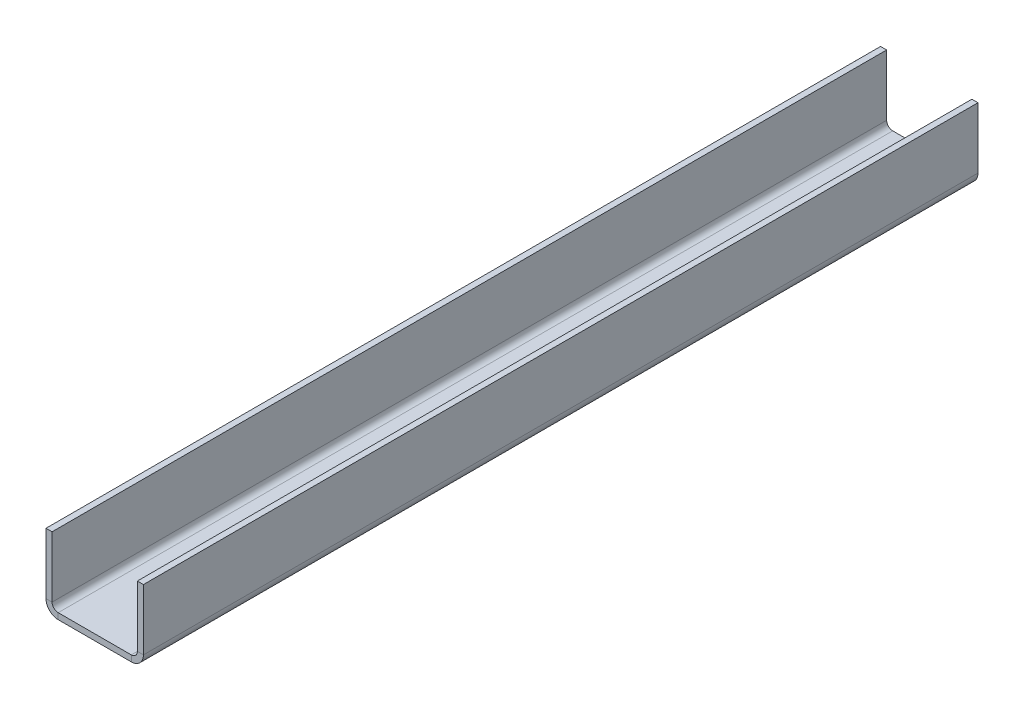
ISO-10303-21;
HEADER;
FILE_DESCRIPTION(('STEP AP214'),'2;1');
FILE_NAME('part.step','',(''),(''),'','','');
FILE_SCHEMA(('AUTOMOTIVE_DESIGN { 1 0 10303 214 1 1 1 1 }'));
ENDSEC;
DATA;
#1=APPLICATION_CONTEXT('core data for automotive mechanical design processes');
#2=APPLICATION_PROTOCOL_DEFINITION('international standard','automotive_design',2000,#1);
#3=PRODUCT_CONTEXT('',#1,'mechanical');
#4=PRODUCT('Part','Part','',(#3));
#5=PRODUCT_RELATED_PRODUCT_CATEGORY('part','',(#4));
#6=PRODUCT_DEFINITION_FORMATION('','',#4);
#7=PRODUCT_DEFINITION_CONTEXT('part definition',#1,'design');
#8=PRODUCT_DEFINITION('design','',#6,#7);
#9=PRODUCT_DEFINITION_SHAPE('','',#8);
#10=(LENGTH_UNIT() NAMED_UNIT(*) SI_UNIT(.MILLI.,.METRE.));
#11=(NAMED_UNIT(*) PLANE_ANGLE_UNIT() SI_UNIT($,.RADIAN.));
#12=(NAMED_UNIT(*) SI_UNIT($,.STERADIAN.) SOLID_ANGLE_UNIT());
#13=UNCERTAINTY_MEASURE_WITH_UNIT(LENGTH_MEASURE(1.E-05),#10,'distance_accuracy_value','');
#14=(GEOMETRIC_REPRESENTATION_CONTEXT(3) GLOBAL_UNCERTAINTY_ASSIGNED_CONTEXT((#13)) GLOBAL_UNIT_ASSIGNED_CONTEXT((#10,
#11,#12)) REPRESENTATION_CONTEXT('',''));
#15=CARTESIAN_POINT('',(0.,0.,0.));
#16=DIRECTION('',(0.,0.,1.));
#17=DIRECTION('',(1.,0.,0.));
#18=AXIS2_PLACEMENT_3D('',#15,#16,#17);
#19=CARTESIAN_POINT('',(0.,6.35,434.975));
#20=DIRECTION('',(0.,0.,1.));
#21=DIRECTION('',(1.,0.,0.));
#22=AXIS2_PLACEMENT_3D('',#19,#20,#21);
#23=PLANE('',#22);
#24=DIRECTION('',(1.,0.,0.));
#25=VECTOR('',#24,1.);
#26=CARTESIAN_POINT('',(0.,6.35,434.975));
#27=LINE('',#26,#25);
#28=CARTESIAN_POINT('',(0.,6.35,434.975));
#29=VERTEX_POINT('',#28);
#30=CARTESIAN_POINT('',(3.175,6.35,434.975));
#31=VERTEX_POINT('',#30);
#32=EDGE_CURVE('E11',#29,#31,#27,.T.);
#33=ORIENTED_EDGE('',*,*,#32,.F.);
#34=CARTESIAN_POINT('',(6.35,6.35,434.975));
#35=DIRECTION('',(0.,0.,-1.));
#36=DIRECTION('',(-1.,0.,0.));
#37=AXIS2_PLACEMENT_3D('',#34,#35,#36);
#38=CIRCLE('',#37,6.35);
#39=CARTESIAN_POINT('',(6.35,0.,434.975));
#40=VERTEX_POINT('',#39);
#41=EDGE_CURVE('E147',#29,#40,#38,.F.);
#42=ORIENTED_EDGE('',*,*,#41,.T.);
#43=DIRECTION('',(0.,-1.,0.));
#44=VECTOR('',#43,1.);
#45=CARTESIAN_POINT('',(6.35,3.175,434.975));
#46=LINE('',#45,#44);
#47=CARTESIAN_POINT('',(6.35,3.175,434.975));
#48=VERTEX_POINT('',#47);
#49=EDGE_CURVE('E45',#48,#40,#46,.T.);
#50=ORIENTED_EDGE('',*,*,#49,.F.);
#51=CARTESIAN_POINT('',(6.35,6.35,434.975));
#52=DIRECTION('',(0.,0.,1.));
#53=DIRECTION('',(1.,0.,0.));
#54=AXIS2_PLACEMENT_3D('',#51,#52,#53);
#55=CIRCLE('',#54,3.175);
#56=EDGE_CURVE('E241',#31,#48,#55,.T.);
#57=ORIENTED_EDGE('',*,*,#56,.F.);
#58=EDGE_LOOP('',(#33,#42,#50,#57));
#59=FACE_BOUND('',#58,.T.);
#60=ADVANCED_FACE('F37',(#59),#23,.T.);
#61=CARTESIAN_POINT('',(6.35,3.175,434.975));
#62=DIRECTION('',(0.,0.,1.));
#63=DIRECTION('',(1.,0.,0.));
#64=AXIS2_PLACEMENT_3D('',#61,#62,#63);
#65=PLANE('',#64);
#66=DIRECTION('',(0.,-1.,0.));
#67=VECTOR('',#66,1.);
#68=CARTESIAN_POINT('',(0.,0.,434.975));
#69=LINE('',#68,#67);
#70=CARTESIAN_POINT('',(0.,38.1,434.975));
#71=VERTEX_POINT('',#70);
#72=EDGE_CURVE('E152',#71,#29,#69,.T.);
#73=ORIENTED_EDGE('',*,*,#72,.T.);
#74=ORIENTED_EDGE('',*,*,#32,.T.);
#75=DIRECTION('',(0.,1.,0.));
#76=VECTOR('',#75,1.);
#77=CARTESIAN_POINT('',(3.175,0.,434.975));
#78=LINE('',#77,#76);
#79=CARTESIAN_POINT('',(3.175,38.1,434.975));
#80=VERTEX_POINT('',#79);
#81=EDGE_CURVE('E254',#80,#31,#78,.F.);
#82=ORIENTED_EDGE('',*,*,#81,.F.);
#83=DIRECTION('',(1.,0.,0.));
#84=VECTOR('',#83,1.);
#85=CARTESIAN_POINT('',(0.,38.1,434.975));
#86=LINE('',#85,#84);
#87=EDGE_CURVE('E256',#71,#80,#86,.T.);
#88=ORIENTED_EDGE('',*,*,#87,.F.);
#89=EDGE_LOOP('',(#73,#74,#82,#88));
#90=FACE_BOUND('',#89,.T.);
#91=ADVANCED_FACE('F267',(#90),#65,.T.);
#92=CARTESIAN_POINT('',(6.35,0.,0.));
#93=DIRECTION('',(0.,0.,-1.));
#94=DIRECTION('',(-1.,0.,0.));
#95=AXIS2_PLACEMENT_3D('',#92,#93,#94);
#96=PLANE('',#95);
#97=DIRECTION('',(0.,1.,0.));
#98=VECTOR('',#97,1.);
#99=CARTESIAN_POINT('',(6.35,0.,0.));
#100=LINE('',#99,#98);
#101=CARTESIAN_POINT('',(6.35,0.,0.));
#102=VERTEX_POINT('',#101);
#103=CARTESIAN_POINT('',(6.35,3.175,0.));
#104=VERTEX_POINT('',#103);
#105=EDGE_CURVE('E145',#102,#104,#100,.T.);
#106=ORIENTED_EDGE('',*,*,#105,.F.);
#107=CARTESIAN_POINT('',(6.35,6.35,0.));
#108=DIRECTION('',(0.,0.,-1.));
#109=DIRECTION('',(-1.,0.,0.));
#110=AXIS2_PLACEMENT_3D('',#107,#108,#109);
#111=CIRCLE('',#110,6.35);
#112=CARTESIAN_POINT('',(0.,6.35,0.));
#113=VERTEX_POINT('',#112);
#114=EDGE_CURVE('E159',#113,#102,#111,.F.);
#115=ORIENTED_EDGE('',*,*,#114,.F.);
#116=DIRECTION('',(-1.,0.,0.));
#117=VECTOR('',#116,1.);
#118=CARTESIAN_POINT('',(3.175,6.35,0.));
#119=LINE('',#118,#117);
#120=CARTESIAN_POINT('',(3.175,6.35,0.));
#121=VERTEX_POINT('',#120);
#122=EDGE_CURVE('E232',#121,#113,#119,.T.);
#123=ORIENTED_EDGE('',*,*,#122,.F.);
#124=CARTESIAN_POINT('',(6.35,6.35,0.));
#125=DIRECTION('',(0.,0.,1.));
#126=DIRECTION('',(1.,0.,0.));
#127=AXIS2_PLACEMENT_3D('',#124,#125,#126);
#128=CIRCLE('',#127,3.175);
#129=EDGE_CURVE('E186',#121,#104,#128,.T.);
#130=ORIENTED_EDGE('',*,*,#129,.T.);
#131=EDGE_LOOP('',(#106,#115,#123,#130));
#132=FACE_BOUND('',#131,.T.);
#133=ADVANCED_FACE('F246',(#132),#96,.T.);
#134=CARTESIAN_POINT('',(3.175,6.35,0.));
#135=DIRECTION('',(0.,0.,-1.));
#136=DIRECTION('',(-1.,0.,0.));
#137=AXIS2_PLACEMENT_3D('',#134,#135,#136);
#138=PLANE('',#137);
#139=DIRECTION('',(1.,0.,0.));
#140=VECTOR('',#139,1.);
#141=CARTESIAN_POINT('',(0.,0.,0.));
#142=LINE('',#141,#140);
#143=CARTESIAN_POINT('',(44.45,0.,0.));
#144=VERTEX_POINT('',#143);
#145=EDGE_CURVE('E199',#102,#144,#142,.T.);
#146=ORIENTED_EDGE('',*,*,#145,.F.);
#147=ORIENTED_EDGE('',*,*,#105,.T.);
#148=DIRECTION('',(1.,0.,0.));
#149=VECTOR('',#148,1.);
#150=CARTESIAN_POINT('',(0.,3.175,0.));
#151=LINE('',#150,#149);
#152=CARTESIAN_POINT('',(44.45,3.175,0.));
#153=VERTEX_POINT('',#152);
#154=EDGE_CURVE('E184',#104,#153,#151,.T.);
#155=ORIENTED_EDGE('',*,*,#154,.T.);
#156=DIRECTION('',(0.,-1.,0.));
#157=VECTOR('',#156,1.);
#158=CARTESIAN_POINT('',(44.45,3.175,0.));
#159=LINE('',#158,#157);
#160=EDGE_CURVE('E94',#153,#144,#159,.T.);
#161=ORIENTED_EDGE('',*,*,#160,.T.);
#162=EDGE_LOOP('',(#146,#147,#155,#161));
#163=FACE_BOUND('',#162,.T.);
#164=ADVANCED_FACE('F234',(#163),#138,.T.);
#165=CARTESIAN_POINT('',(44.45,0.,434.975));
#166=DIRECTION('',(0.,0.,1.));
#167=DIRECTION('',(1.,0.,0.));
#168=AXIS2_PLACEMENT_3D('',#165,#166,#167);
#169=PLANE('',#168);
#170=DIRECTION('',(0.,1.,0.));
#171=VECTOR('',#170,1.);
#172=CARTESIAN_POINT('',(44.45,0.,434.975));
#173=LINE('',#172,#171);
#174=CARTESIAN_POINT('',(44.45,0.,434.975));
#175=VERTEX_POINT('',#174);
#176=CARTESIAN_POINT('',(44.45,3.175,434.975));
#177=VERTEX_POINT('',#176);
#178=EDGE_CURVE('E230',#175,#177,#173,.T.);
#179=ORIENTED_EDGE('',*,*,#178,.F.);
#180=CARTESIAN_POINT('',(44.45,6.35,434.975));
#181=DIRECTION('',(0.,0.,-1.));
#182=DIRECTION('',(-1.,0.,0.));
#183=AXIS2_PLACEMENT_3D('',#180,#181,#182);
#184=CIRCLE('',#183,6.35);
#185=CARTESIAN_POINT('',(50.8,6.35,434.975));
#186=VERTEX_POINT('',#185);
#187=EDGE_CURVE('E167',#175,#186,#184,.F.);
#188=ORIENTED_EDGE('',*,*,#187,.T.);
#189=DIRECTION('',(1.,0.,0.));
#190=VECTOR('',#189,1.);
#191=CARTESIAN_POINT('',(47.625,6.35,434.975));
#192=LINE('',#191,#190);
#193=CARTESIAN_POINT('',(47.625,6.35,434.975));
#194=VERTEX_POINT('',#193);
#195=EDGE_CURVE('E53',#194,#186,#192,.T.);
#196=ORIENTED_EDGE('',*,*,#195,.F.);
#197=CARTESIAN_POINT('',(44.45,6.35,434.975));
#198=DIRECTION('',(0.,0.,1.));
#199=DIRECTION('',(1.,0.,0.));
#200=AXIS2_PLACEMENT_3D('',#197,#198,#199);
#201=CIRCLE('',#200,3.175);
#202=EDGE_CURVE('E258',#177,#194,#201,.T.);
#203=ORIENTED_EDGE('',*,*,#202,.F.);
#204=EDGE_LOOP('',(#179,#188,#196,#203));
#205=FACE_BOUND('',#204,.T.);
#206=ADVANCED_FACE('F293',(#205),#169,.T.);
#207=CARTESIAN_POINT('',(47.625,6.35,434.975));
#208=DIRECTION('',(0.,0.,1.));
#209=DIRECTION('',(1.,0.,0.));
#210=AXIS2_PLACEMENT_3D('',#207,#208,#209);
#211=PLANE('',#210);
#212=DIRECTION('',(1.,0.,0.));
#213=VECTOR('',#212,1.);
#214=CARTESIAN_POINT('',(0.,0.,434.975));
#215=LINE('',#214,#213);
#216=EDGE_CURVE('E137',#40,#175,#215,.T.);
#217=ORIENTED_EDGE('',*,*,#216,.T.);
#218=ORIENTED_EDGE('',*,*,#178,.T.);
#219=DIRECTION('',(1.,0.,0.));
#220=VECTOR('',#219,1.);
#221=CARTESIAN_POINT('',(0.,3.175,434.975));
#222=LINE('',#221,#220);
#223=EDGE_CURVE('E140',#48,#177,#222,.T.);
#224=ORIENTED_EDGE('',*,*,#223,.F.);
#225=ORIENTED_EDGE('',*,*,#49,.T.);
#226=EDGE_LOOP('',(#217,#218,#224,#225));
#227=FACE_BOUND('',#226,.T.);
#228=ADVANCED_FACE('F135',(#227),#211,.T.);
#229=CARTESIAN_POINT('',(50.8,6.35,0.));
#230=DIRECTION('',(0.,0.,-1.));
#231=DIRECTION('',(-1.,0.,0.));
#232=AXIS2_PLACEMENT_3D('',#229,#230,#231);
#233=PLANE('',#232);
#234=DIRECTION('',(-1.,0.,0.));
#235=VECTOR('',#234,1.);
#236=CARTESIAN_POINT('',(50.8,6.35,0.));
#237=LINE('',#236,#235);
#238=CARTESIAN_POINT('',(50.8,6.35,0.));
#239=VERTEX_POINT('',#238);
#240=CARTESIAN_POINT('',(47.625,6.35,0.));
#241=VERTEX_POINT('',#240);
#242=EDGE_CURVE('E101',#239,#241,#237,.T.);
#243=ORIENTED_EDGE('',*,*,#242,.F.);
#244=CARTESIAN_POINT('',(44.45,6.35,0.));
#245=DIRECTION('',(0.,0.,-1.));
#246=DIRECTION('',(-1.,0.,0.));
#247=AXIS2_PLACEMENT_3D('',#244,#245,#246);
#248=CIRCLE('',#247,6.35);
#249=EDGE_CURVE('E201',#144,#239,#248,.F.);
#250=ORIENTED_EDGE('',*,*,#249,.F.);
#251=ORIENTED_EDGE('',*,*,#160,.F.);
#252=CARTESIAN_POINT('',(44.45,6.35,0.));
#253=DIRECTION('',(0.,0.,1.));
#254=DIRECTION('',(1.,0.,0.));
#255=AXIS2_PLACEMENT_3D('',#252,#253,#254);
#256=CIRCLE('',#255,3.175);
#257=EDGE_CURVE('E182',#153,#241,#256,.T.);
#258=ORIENTED_EDGE('',*,*,#257,.T.);
#259=EDGE_LOOP('',(#243,#250,#251,#258));
#260=FACE_BOUND('',#259,.T.);
#261=ADVANCED_FACE('F299',(#260),#233,.T.);
#262=CARTESIAN_POINT('',(44.45,3.175,0.));
#263=DIRECTION('',(0.,0.,-1.));
#264=DIRECTION('',(-1.,0.,0.));
#265=AXIS2_PLACEMENT_3D('',#262,#263,#264);
#266=PLANE('',#265);
#267=DIRECTION('',(0.,1.,0.));
#268=VECTOR('',#267,1.);
#269=CARTESIAN_POINT('',(50.8,0.,0.));
#270=LINE('',#269,#268);
#271=CARTESIAN_POINT('',(50.8,38.1,0.));
#272=VERTEX_POINT('',#271);
#273=EDGE_CURVE('E173',#239,#272,#270,.T.);
#274=ORIENTED_EDGE('',*,*,#273,.F.);
#275=ORIENTED_EDGE('',*,*,#242,.T.);
#276=DIRECTION('',(0.,1.,0.));
#277=VECTOR('',#276,1.);
#278=CARTESIAN_POINT('',(47.625,0.,0.));
#279=LINE('',#278,#277);
#280=CARTESIAN_POINT('',(47.625,38.1,0.));
#281=VERTEX_POINT('',#280);
#282=EDGE_CURVE('E179',#241,#281,#279,.T.);
#283=ORIENTED_EDGE('',*,*,#282,.T.);
#284=DIRECTION('',(1.,0.,0.));
#285=VECTOR('',#284,1.);
#286=CARTESIAN_POINT('',(47.625,38.1,0.));
#287=LINE('',#286,#285);
#288=EDGE_CURVE('E176',#281,#272,#287,.T.);
#289=ORIENTED_EDGE('',*,*,#288,.T.);
#290=EDGE_LOOP('',(#274,#275,#283,#289));
#291=FACE_BOUND('',#290,.T.);
#292=ADVANCED_FACE('F302',(#291),#266,.T.);
#293=CARTESIAN_POINT('',(50.8,0.,434.975));
#294=DIRECTION('',(-1.,0.,0.));
#295=DIRECTION('',(0.,0.,1.));
#296=AXIS2_PLACEMENT_3D('',#293,#294,#295);
#297=PLANE('',#296);
#298=ORIENTED_EDGE('',*,*,#273,.T.);
#299=DIRECTION('',(0.,0.,-1.));
#300=VECTOR('',#299,1.);
#301=CARTESIAN_POINT('',(50.8,38.1,434.975));
#302=LINE('',#301,#300);
#303=CARTESIAN_POINT('',(50.8,38.1,434.975));
#304=VERTEX_POINT('',#303);
#305=EDGE_CURVE('E225',#304,#272,#302,.T.);
#306=ORIENTED_EDGE('',*,*,#305,.F.);
#307=DIRECTION('',(0.,1.,0.));
#308=VECTOR('',#307,1.);
#309=CARTESIAN_POINT('',(50.8,0.,434.975));
#310=LINE('',#309,#308);
#311=EDGE_CURVE('E107',#186,#304,#310,.T.);
#312=ORIENTED_EDGE('',*,*,#311,.F.);
#313=DIRECTION('',(0.,0.,-1.));
#314=VECTOR('',#313,1.);
#315=CARTESIAN_POINT('',(50.8,6.35,434.975));
#316=LINE('',#315,#314);
#317=EDGE_CURVE('E169',#186,#239,#316,.T.);
#318=ORIENTED_EDGE('',*,*,#317,.T.);
#319=EDGE_LOOP('',(#298,#306,#312,#318));
#320=FACE_BOUND('',#319,.T.);
#321=ADVANCED_FACE('F305',(#320),#297,.F.);
#322=CARTESIAN_POINT('',(47.625,38.1,434.975));
#323=DIRECTION('',(0.,1.,0.));
#324=DIRECTION('',(0.,0.,1.));
#325=AXIS2_PLACEMENT_3D('',#322,#323,#324);
#326=PLANE('',#325);
#327=ORIENTED_EDGE('',*,*,#288,.F.);
#328=DIRECTION('',(0.,0.,-1.));
#329=VECTOR('',#328,1.);
#330=CARTESIAN_POINT('',(47.625,38.1,434.975));
#331=LINE('',#330,#329);
#332=CARTESIAN_POINT('',(47.625,38.1,434.975));
#333=VERTEX_POINT('',#332);
#334=EDGE_CURVE('E223',#333,#281,#331,.T.);
#335=ORIENTED_EDGE('',*,*,#334,.F.);
#336=DIRECTION('',(1.,0.,0.));
#337=VECTOR('',#336,1.);
#338=CARTESIAN_POINT('',(47.625,38.1,434.975));
#339=LINE('',#338,#337);
#340=EDGE_CURVE('E513',#333,#304,#339,.T.);
#341=ORIENTED_EDGE('',*,*,#340,.T.);
#342=ORIENTED_EDGE('',*,*,#305,.T.);
#343=EDGE_LOOP('',(#327,#335,#341,#342));
#344=FACE_BOUND('',#343,.T.);
#345=ADVANCED_FACE('F309',(#344),#326,.T.);
#346=CARTESIAN_POINT('',(47.625,0.,434.975));
#347=DIRECTION('',(-1.,0.,0.));
#348=DIRECTION('',(0.,0.,1.));
#349=AXIS2_PLACEMENT_3D('',#346,#347,#348);
#350=PLANE('',#349);
#351=ORIENTED_EDGE('',*,*,#282,.F.);
#352=DIRECTION('',(0.,0.,-1.));
#353=VECTOR('',#352,1.);
#354=CARTESIAN_POINT('',(47.625,6.35,434.975));
#355=LINE('',#354,#353);
#356=EDGE_CURVE('E220',#194,#241,#355,.T.);
#357=ORIENTED_EDGE('',*,*,#356,.F.);
#358=DIRECTION('',(0.,1.,0.));
#359=VECTOR('',#358,1.);
#360=CARTESIAN_POINT('',(47.625,0.,434.975));
#361=LINE('',#360,#359);
#362=EDGE_CURVE('E515',#194,#333,#361,.T.);
#363=ORIENTED_EDGE('',*,*,#362,.T.);
#364=ORIENTED_EDGE('',*,*,#334,.T.);
#365=EDGE_LOOP('',(#351,#357,#363,#364));
#366=FACE_BOUND('',#365,.T.);
#367=ADVANCED_FACE('F313',(#366),#350,.T.);
#368=CARTESIAN_POINT('',(44.45,6.35,434.975));
#369=DIRECTION('',(0.,0.,-1.));
#370=DIRECTION('',(-1.,0.,0.));
#371=AXIS2_PLACEMENT_3D('',#368,#369,#370);
#372=CYLINDRICAL_SURFACE('',#371,3.175);
#373=ORIENTED_EDGE('',*,*,#257,.F.);
#374=DIRECTION('',(0.,0.,-1.));
#375=VECTOR('',#374,1.);
#376=CARTESIAN_POINT('',(44.45,3.175,434.975));
#377=LINE('',#376,#375);
#378=EDGE_CURVE('E217',#177,#153,#377,.T.);
#379=ORIENTED_EDGE('',*,*,#378,.F.);
#380=ORIENTED_EDGE('',*,*,#202,.T.);
#381=ORIENTED_EDGE('',*,*,#356,.T.);
#382=EDGE_LOOP('',(#373,#379,#380,#381));
#383=FACE_BOUND('',#382,.T.);
#384=ADVANCED_FACE('F317',(#383),#372,.F.);
#385=CARTESIAN_POINT('',(0.,3.175,434.975));
#386=DIRECTION('',(0.,1.,0.));
#387=DIRECTION('',(0.,0.,1.));
#388=AXIS2_PLACEMENT_3D('',#385,#386,#387);
#389=PLANE('',#388);
#390=ORIENTED_EDGE('',*,*,#154,.F.);
#391=DIRECTION('',(0.,0.,-1.));
#392=VECTOR('',#391,1.);
#393=CARTESIAN_POINT('',(6.35,3.175,434.975));
#394=LINE('',#393,#392);
#395=EDGE_CURVE('E214',#48,#104,#394,.T.);
#396=ORIENTED_EDGE('',*,*,#395,.F.);
#397=ORIENTED_EDGE('',*,*,#223,.T.);
#398=ORIENTED_EDGE('',*,*,#378,.T.);
#399=EDGE_LOOP('',(#390,#396,#397,#398));
#400=FACE_BOUND('',#399,.T.);
#401=ADVANCED_FACE('F243',(#400),#389,.T.);
#402=CARTESIAN_POINT('',(6.35,6.35,434.975));
#403=DIRECTION('',(0.,0.,-1.));
#404=DIRECTION('',(-1.,0.,0.));
#405=AXIS2_PLACEMENT_3D('',#402,#403,#404);
#406=CYLINDRICAL_SURFACE('',#405,3.175);
#407=ORIENTED_EDGE('',*,*,#129,.F.);
#408=DIRECTION('',(0.,0.,-1.));
#409=VECTOR('',#408,1.);
#410=CARTESIAN_POINT('',(3.175,6.35,434.975));
#411=LINE('',#410,#409);
#412=EDGE_CURVE('E211',#31,#121,#411,.T.);
#413=ORIENTED_EDGE('',*,*,#412,.F.);
#414=ORIENTED_EDGE('',*,*,#56,.T.);
#415=ORIENTED_EDGE('',*,*,#395,.T.);
#416=EDGE_LOOP('',(#407,#413,#414,#415));
#417=FACE_BOUND('',#416,.T.);
#418=ADVANCED_FACE('F239',(#417),#406,.F.);
#419=CARTESIAN_POINT('',(3.175,0.,434.975));
#420=DIRECTION('',(1.,0.,0.));
#421=DIRECTION('',(0.,0.,-1.));
#422=AXIS2_PLACEMENT_3D('',#419,#420,#421);
#423=PLANE('',#422);
#424=DIRECTION('',(0.,1.,0.));
#425=VECTOR('',#424,1.);
#426=CARTESIAN_POINT('',(3.175,0.,0.));
#427=LINE('',#426,#425);
#428=CARTESIAN_POINT('',(3.175,38.1,0.));
#429=VERTEX_POINT('',#428);
#430=EDGE_CURVE('E189',#429,#121,#427,.F.);
#431=ORIENTED_EDGE('',*,*,#430,.F.);
#432=DIRECTION('',(0.,0.,-1.));
#433=VECTOR('',#432,1.);
#434=CARTESIAN_POINT('',(3.175,38.1,434.975));
#435=LINE('',#434,#433);
#436=EDGE_CURVE('E209',#80,#429,#435,.T.);
#437=ORIENTED_EDGE('',*,*,#436,.F.);
#438=ORIENTED_EDGE('',*,*,#81,.T.);
#439=ORIENTED_EDGE('',*,*,#412,.T.);
#440=EDGE_LOOP('',(#431,#437,#438,#439));
#441=FACE_BOUND('',#440,.T.);
#442=ADVANCED_FACE('F252',(#441),#423,.T.);
#443=CARTESIAN_POINT('',(0.,38.1,434.975));
#444=DIRECTION('',(0.,1.,0.));
#445=DIRECTION('',(0.,0.,1.));
#446=AXIS2_PLACEMENT_3D('',#443,#444,#445);
#447=PLANE('',#446);
#448=DIRECTION('',(1.,0.,0.));
#449=VECTOR('',#448,1.);
#450=CARTESIAN_POINT('',(0.,38.1,0.));
#451=LINE('',#450,#449);
#452=CARTESIAN_POINT('',(0.,38.1,0.));
#453=VERTEX_POINT('',#452);
#454=EDGE_CURVE('E192',#453,#429,#451,.T.);
#455=ORIENTED_EDGE('',*,*,#454,.F.);
#456=DIRECTION('',(0.,0.,-1.));
#457=VECTOR('',#456,1.);
#458=CARTESIAN_POINT('',(0.,38.1,434.975));
#459=LINE('',#458,#457);
#460=EDGE_CURVE('E207',#71,#453,#459,.T.);
#461=ORIENTED_EDGE('',*,*,#460,.F.);
#462=ORIENTED_EDGE('',*,*,#87,.T.);
#463=ORIENTED_EDGE('',*,*,#436,.T.);
#464=EDGE_LOOP('',(#455,#461,#462,#463));
#465=FACE_BOUND('',#464,.T.);
#466=ADVANCED_FACE('F273',(#465),#447,.T.);
#467=CARTESIAN_POINT('',(0.,0.,434.975));
#468=DIRECTION('',(1.,0.,0.));
#469=DIRECTION('',(0.,0.,-1.));
#470=AXIS2_PLACEMENT_3D('',#467,#468,#469);
#471=PLANE('',#470);
#472=DIRECTION('',(0.,-1.,0.));
#473=VECTOR('',#472,1.);
#474=CARTESIAN_POINT('',(0.,0.,0.));
#475=LINE('',#474,#473);
#476=EDGE_CURVE('E195',#453,#113,#475,.T.);
#477=ORIENTED_EDGE('',*,*,#476,.T.);
#478=DIRECTION('',(0.,0.,-1.));
#479=VECTOR('',#478,1.);
#480=CARTESIAN_POINT('',(0.,6.35,434.975));
#481=LINE('',#480,#479);
#482=EDGE_CURVE('E161',#29,#113,#481,.T.);
#483=ORIENTED_EDGE('',*,*,#482,.F.);
#484=ORIENTED_EDGE('',*,*,#72,.F.);
#485=ORIENTED_EDGE('',*,*,#460,.T.);
#486=EDGE_LOOP('',(#477,#483,#484,#485));
#487=FACE_BOUND('',#486,.T.);
#488=ADVANCED_FACE('F269',(#487),#471,.F.);
#489=CARTESIAN_POINT('',(6.35,6.35,434.975));
#490=DIRECTION('',(0.,0.,-1.));
#491=DIRECTION('',(-1.,0.,0.));
#492=AXIS2_PLACEMENT_3D('',#489,#490,#491);
#493=CYLINDRICAL_SURFACE('',#492,6.35);
#494=ORIENTED_EDGE('',*,*,#114,.T.);
#495=DIRECTION('',(0.,0.,-1.));
#496=VECTOR('',#495,1.);
#497=CARTESIAN_POINT('',(6.35,0.,434.975));
#498=LINE('',#497,#496);
#499=EDGE_CURVE('E156',#40,#102,#498,.T.);
#500=ORIENTED_EDGE('',*,*,#499,.F.);
#501=ORIENTED_EDGE('',*,*,#41,.F.);
#502=ORIENTED_EDGE('',*,*,#482,.T.);
#503=EDGE_LOOP('',(#494,#500,#501,#502));
#504=FACE_BOUND('',#503,.T.);
#505=ADVANCED_FACE('F157',(#504),#493,.T.);
#506=CARTESIAN_POINT('',(0.,0.,434.975));
#507=DIRECTION('',(0.,1.,0.));
#508=DIRECTION('',(0.,0.,1.));
#509=AXIS2_PLACEMENT_3D('',#506,#507,#508);
#510=PLANE('',#509);
#511=ORIENTED_EDGE('',*,*,#145,.T.);
#512=DIRECTION('',(0.,0.,-1.));
#513=VECTOR('',#512,1.);
#514=CARTESIAN_POINT('',(44.45,0.,434.975));
#515=LINE('',#514,#513);
#516=EDGE_CURVE('E162',#175,#144,#515,.T.);
#517=ORIENTED_EDGE('',*,*,#516,.F.);
#518=ORIENTED_EDGE('',*,*,#216,.F.);
#519=ORIENTED_EDGE('',*,*,#499,.T.);
#520=EDGE_LOOP('',(#511,#517,#518,#519));
#521=FACE_BOUND('',#520,.T.);
#522=ADVANCED_FACE('F164',(#521),#510,.F.);
#523=CARTESIAN_POINT('',(44.45,6.35,434.975));
#524=DIRECTION('',(0.,0.,-1.));
#525=DIRECTION('',(-1.,0.,0.));
#526=AXIS2_PLACEMENT_3D('',#523,#524,#525);
#527=CYLINDRICAL_SURFACE('',#526,6.35);
#528=ORIENTED_EDGE('',*,*,#249,.T.);
#529=ORIENTED_EDGE('',*,*,#317,.F.);
#530=ORIENTED_EDGE('',*,*,#187,.F.);
#531=ORIENTED_EDGE('',*,*,#516,.T.);
#532=EDGE_LOOP('',(#528,#529,#530,#531));
#533=FACE_BOUND('',#532,.T.);
#534=ADVANCED_FACE('F364',(#533),#527,.T.);
#535=CARTESIAN_POINT('',(44.45,6.35,434.975));
#536=DIRECTION('',(0.,0.,1.));
#537=DIRECTION('',(1.,0.,0.));
#538=AXIS2_PLACEMENT_3D('',#535,#536,#537);
#539=PLANE('',#538);
#540=ORIENTED_EDGE('',*,*,#311,.T.);
#541=ORIENTED_EDGE('',*,*,#340,.F.);
#542=ORIENTED_EDGE('',*,*,#362,.F.);
#543=ORIENTED_EDGE('',*,*,#195,.T.);
#544=EDGE_LOOP('',(#540,#541,#542,#543));
#545=FACE_BOUND('',#544,.T.);
#546=ADVANCED_FACE('F374',(#545),#539,.T.);
#547=CARTESIAN_POINT('',(44.45,6.35,0.));
#548=DIRECTION('',(0.,0.,1.));
#549=DIRECTION('',(1.,0.,0.));
#550=AXIS2_PLACEMENT_3D('',#547,#548,#549);
#551=PLANE('',#550);
#552=ORIENTED_EDGE('',*,*,#430,.T.);
#553=ORIENTED_EDGE('',*,*,#122,.T.);
#554=ORIENTED_EDGE('',*,*,#476,.F.);
#555=ORIENTED_EDGE('',*,*,#454,.T.);
#556=EDGE_LOOP('',(#552,#553,#554,#555));
#557=FACE_BOUND('',#556,.T.);
#558=ADVANCED_FACE('F271',(#557),#551,.F.);
#559=CLOSED_SHELL('',(#60,#91,#133,#164,#206,#228,#261,#292,#321,#345,#367,#384,#401,#418,#442,
#466,#488,#505,#522,#534,#546,#558));
#560=MANIFOLD_SOLID_BREP('B2',#559);
#561=ADVANCED_BREP_SHAPE_REPRESENTATION('',(#18,#560),#14);
#562=SHAPE_DEFINITION_REPRESENTATION(#9,#561);
ENDSEC;
END-ISO-10303-21;
